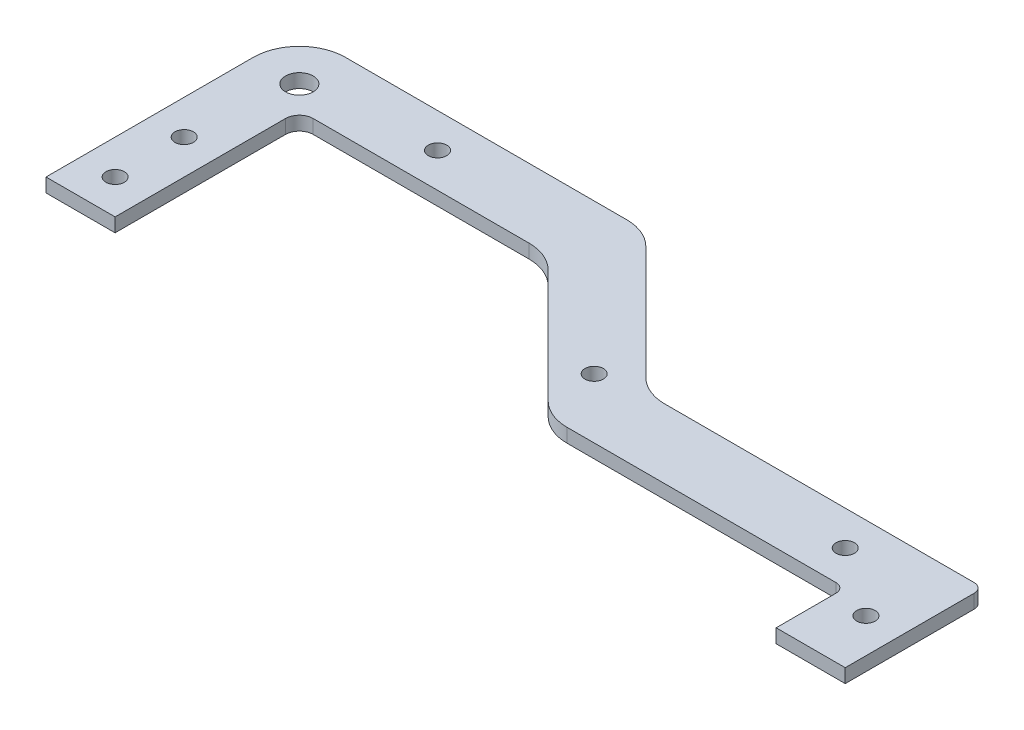
ISO-10303-21;
HEADER;
FILE_DESCRIPTION(('STEP AP214'),'2;1');
FILE_NAME('part.step','',(''),(''),'','','');
FILE_SCHEMA(('AUTOMOTIVE_DESIGN { 1 0 10303 214 1 1 1 1 }'));
ENDSEC;
DATA;
#1=APPLICATION_CONTEXT('core data for automotive mechanical design processes');
#2=APPLICATION_PROTOCOL_DEFINITION('international standard','automotive_design',2000,#1);
#3=PRODUCT_CONTEXT('',#1,'mechanical');
#4=PRODUCT('Part','Part','',(#3));
#5=PRODUCT_RELATED_PRODUCT_CATEGORY('part','',(#4));
#6=PRODUCT_DEFINITION_FORMATION('','',#4);
#7=PRODUCT_DEFINITION_CONTEXT('part definition',#1,'design');
#8=PRODUCT_DEFINITION('design','',#6,#7);
#9=PRODUCT_DEFINITION_SHAPE('','',#8);
#10=(LENGTH_UNIT() NAMED_UNIT(*) SI_UNIT(.MILLI.,.METRE.));
#11=(NAMED_UNIT(*) PLANE_ANGLE_UNIT() SI_UNIT($,.RADIAN.));
#12=(NAMED_UNIT(*) SI_UNIT($,.STERADIAN.) SOLID_ANGLE_UNIT());
#13=UNCERTAINTY_MEASURE_WITH_UNIT(LENGTH_MEASURE(1.E-05),#10,'distance_accuracy_value','');
#14=(GEOMETRIC_REPRESENTATION_CONTEXT(3) GLOBAL_UNCERTAINTY_ASSIGNED_CONTEXT((#13)) GLOBAL_UNIT_ASSIGNED_CONTEXT((#10,
#11,#12)) REPRESENTATION_CONTEXT('',''));
#15=CARTESIAN_POINT('',(0.,0.,0.));
#16=DIRECTION('',(0.,0.,1.));
#17=DIRECTION('',(1.,0.,0.));
#18=AXIS2_PLACEMENT_3D('',#15,#16,#17);
#19=CARTESIAN_POINT('',(-113.286796564404,3.,-30.));
#20=DIRECTION('',(0.,0.,1.));
#21=DIRECTION('',(1.,0.,0.));
#22=AXIS2_PLACEMENT_3D('',#19,#20,#21);
#23=PLANE('',#22);
#24=DIRECTION('',(-1.,0.,0.));
#25=VECTOR('',#24,1.);
#26=CARTESIAN_POINT('',(-113.286796564404,3.,-30.));
#27=LINE('',#26,#25);
#28=CARTESIAN_POINT('',(-42.,3.,-30.));
#29=VERTEX_POINT('',#28);
#30=CARTESIAN_POINT('',(-109.144660940673,3.,-30.));
#31=VERTEX_POINT('',#30);
#32=EDGE_CURVE('E283',#29,#31,#27,.T.);
#33=ORIENTED_EDGE('',*,*,#32,.F.);
#34=DIRECTION('',(0.,-1.,0.));
#35=VECTOR('',#34,1.);
#36=CARTESIAN_POINT('',(-42.,3.,-30.));
#37=LINE('',#36,#35);
#38=CARTESIAN_POINT('',(-42.,0.,-30.));
#39=VERTEX_POINT('',#38);
#40=EDGE_CURVE('E382',#29,#39,#37,.T.);
#41=ORIENTED_EDGE('',*,*,#40,.T.);
#42=DIRECTION('',(-1.,0.,0.));
#43=VECTOR('',#42,1.);
#44=CARTESIAN_POINT('',(-113.286796564404,0.,-30.));
#45=LINE('',#44,#43);
#46=CARTESIAN_POINT('',(-109.144660940673,0.,-30.));
#47=VERTEX_POINT('',#46);
#48=EDGE_CURVE('E240',#39,#47,#45,.T.);
#49=ORIENTED_EDGE('',*,*,#48,.T.);
#50=DIRECTION('',(0.,-1.,0.));
#51=VECTOR('',#50,1.);
#52=CARTESIAN_POINT('',(-109.144660940673,3.,-30.));
#53=LINE('',#52,#51);
#54=EDGE_CURVE('E335',#47,#31,#53,.F.);
#55=ORIENTED_EDGE('',*,*,#54,.T.);
#56=EDGE_LOOP('',(#33,#41,#49,#55));
#57=FACE_BOUND('',#56,.T.);
#58=ADVANCED_FACE('F39',(#57),#23,.F.);
#59=CARTESIAN_POINT('',(-113.286796564404,3.,-30.));
#60=DIRECTION('',(-0.707106781186549,0.,0.707106781186546));
#61=DIRECTION('',(0.707106781186546,0.,0.707106781186549));
#62=AXIS2_PLACEMENT_3D('',#59,#60,#61);
#63=PLANE('',#62);
#64=DIRECTION('',(-0.707106781186546,0.,-0.707106781186549));
#65=VECTOR('',#64,1.);
#66=CARTESIAN_POINT('',(-113.286796564404,3.,-30.));
#67=LINE('',#66,#65);
#68=CARTESIAN_POINT('',(-116.215728752538,3.,-32.9289321881345));
#69=VERTEX_POINT('',#68);
#70=CARTESIAN_POINT('',(-140.857864376269,3.,-57.5710678118655));
#71=VERTEX_POINT('',#70);
#72=EDGE_CURVE('E190',#69,#71,#67,.T.);
#73=ORIENTED_EDGE('',*,*,#72,.F.);
#74=DIRECTION('',(0.,-1.,0.));
#75=VECTOR('',#74,1.);
#76=CARTESIAN_POINT('',(-116.215728752538,0.,-32.9289321881345));
#77=LINE('',#76,#75);
#78=CARTESIAN_POINT('',(-116.215728752538,0.,-32.9289321881345));
#79=VERTEX_POINT('',#78);
#80=EDGE_CURVE('E331',#69,#79,#77,.T.);
#81=ORIENTED_EDGE('',*,*,#80,.T.);
#82=DIRECTION('',(-0.707106781186546,0.,-0.707106781186549));
#83=VECTOR('',#82,1.);
#84=CARTESIAN_POINT('',(-113.286796564404,0.,-30.));
#85=LINE('',#84,#83);
#86=CARTESIAN_POINT('',(-140.857864376269,0.,-57.5710678118655));
#87=VERTEX_POINT('',#86);
#88=EDGE_CURVE('E243',#79,#87,#85,.T.);
#89=ORIENTED_EDGE('',*,*,#88,.T.);
#90=DIRECTION('',(0.,-1.,0.));
#91=VECTOR('',#90,1.);
#92=CARTESIAN_POINT('',(-140.857864376269,3.,-57.5710678118655));
#93=LINE('',#92,#91);
#94=EDGE_CURVE('E200',#87,#71,#93,.F.);
#95=ORIENTED_EDGE('',*,*,#94,.T.);
#96=EDGE_LOOP('',(#73,#81,#89,#95));
#97=FACE_BOUND('',#96,.T.);
#98=ADVANCED_FACE('F473',(#97),#63,.F.);
#99=CARTESIAN_POINT('',(-209.,3.,-60.5));
#100=DIRECTION('',(0.,0.,1.));
#101=DIRECTION('',(1.,0.,0.));
#102=AXIS2_PLACEMENT_3D('',#99,#100,#101);
#103=PLANE('',#102);
#104=DIRECTION('',(-1.,0.,0.));
#105=VECTOR('',#104,1.);
#106=CARTESIAN_POINT('',(-209.,3.,-60.5));
#107=LINE('',#106,#105);
#108=CARTESIAN_POINT('',(-147.928932188135,3.,-60.5));
#109=VERTEX_POINT('',#108);
#110=CARTESIAN_POINT('',(-209.,3.,-60.5));
#111=VERTEX_POINT('',#110);
#112=EDGE_CURVE('E176',#109,#111,#107,.T.);
#113=ORIENTED_EDGE('',*,*,#112,.F.);
#114=DIRECTION('',(0.,-1.,0.));
#115=VECTOR('',#114,1.);
#116=CARTESIAN_POINT('',(-147.928932188135,3.,-60.5));
#117=LINE('',#116,#115);
#118=CARTESIAN_POINT('',(-147.928932188135,0.,-60.5));
#119=VERTEX_POINT('',#118);
#120=EDGE_CURVE('E361',#109,#119,#117,.T.);
#121=ORIENTED_EDGE('',*,*,#120,.T.);
#122=DIRECTION('',(-1.,0.,0.));
#123=VECTOR('',#122,1.);
#124=CARTESIAN_POINT('',(-209.,0.,-60.5));
#125=LINE('',#124,#123);
#126=CARTESIAN_POINT('',(-209.,0.,-60.5));
#127=VERTEX_POINT('',#126);
#128=EDGE_CURVE('E196',#119,#127,#125,.T.);
#129=ORIENTED_EDGE('',*,*,#128,.T.);
#130=DIRECTION('',(0.,-1.,0.));
#131=VECTOR('',#130,1.);
#132=CARTESIAN_POINT('',(-209.,3.,-60.5));
#133=LINE('',#132,#131);
#134=EDGE_CURVE('E193',#111,#127,#133,.T.);
#135=ORIENTED_EDGE('',*,*,#134,.F.);
#136=EDGE_LOOP('',(#113,#121,#129,#135));
#137=FACE_BOUND('',#136,.T.);
#138=ADVANCED_FACE('F194',(#137),#103,.F.);
#139=CARTESIAN_POINT('',(-209.,3.,-50.5));
#140=DIRECTION('',(0.,-1.,0.));
#141=DIRECTION('',(0.,0.,-1.));
#142=AXIS2_PLACEMENT_3D('',#139,#140,#141);
#143=CYLINDRICAL_SURFACE('',#142,10.);
#144=CARTESIAN_POINT('',(-209.,0.,-50.5));
#145=DIRECTION('',(0.,1.,0.));
#146=DIRECTION('',(0.,0.,1.));
#147=AXIS2_PLACEMENT_3D('',#144,#145,#146);
#148=CIRCLE('',#147,10.);
#149=CARTESIAN_POINT('',(-219.,0.,-50.4999999999999));
#150=VERTEX_POINT('',#149);
#151=EDGE_CURVE('E250',#127,#150,#148,.T.);
#152=ORIENTED_EDGE('',*,*,#151,.T.);
#153=DIRECTION('',(0.,-1.,0.));
#154=VECTOR('',#153,1.);
#155=CARTESIAN_POINT('',(-219.,3.,-50.4999999999999));
#156=LINE('',#155,#154);
#157=CARTESIAN_POINT('',(-219.,3.,-50.4999999999999));
#158=VERTEX_POINT('',#157);
#159=EDGE_CURVE('E201',#158,#150,#156,.T.);
#160=ORIENTED_EDGE('',*,*,#159,.F.);
#161=CARTESIAN_POINT('',(-209.,3.,-50.5));
#162=DIRECTION('',(0.,1.,0.));
#163=DIRECTION('',(0.,0.,1.));
#164=AXIS2_PLACEMENT_3D('',#161,#162,#163);
#165=CIRCLE('',#164,10.);
#166=EDGE_CURVE('E181',#111,#158,#165,.T.);
#167=ORIENTED_EDGE('',*,*,#166,.F.);
#168=ORIENTED_EDGE('',*,*,#134,.T.);
#169=EDGE_LOOP('',(#152,#160,#167,#168));
#170=FACE_BOUND('',#169,.T.);
#171=ADVANCED_FACE('F203',(#170),#143,.T.);
#172=CARTESIAN_POINT('',(-219.,3.,-50.4999999999999));
#173=DIRECTION('',(1.,0.,0.));
#174=DIRECTION('',(0.,0.,-1.));
#175=AXIS2_PLACEMENT_3D('',#172,#173,#174);
#176=PLANE('',#175);
#177=DIRECTION('',(0.,0.,1.));
#178=VECTOR('',#177,1.);
#179=CARTESIAN_POINT('',(-219.,0.,-50.4999999999999));
#180=LINE('',#179,#178);
#181=CARTESIAN_POINT('',(-219.,0.,-5.5));
#182=VERTEX_POINT('',#181);
#183=EDGE_CURVE('E253',#150,#182,#180,.T.);
#184=ORIENTED_EDGE('',*,*,#183,.T.);
#185=DIRECTION('',(0.,-1.,0.));
#186=VECTOR('',#185,1.);
#187=CARTESIAN_POINT('',(-219.,3.,-5.5));
#188=LINE('',#187,#186);
#189=CARTESIAN_POINT('',(-219.,3.,-5.5));
#190=VERTEX_POINT('',#189);
#191=EDGE_CURVE('E295',#190,#182,#188,.T.);
#192=ORIENTED_EDGE('',*,*,#191,.F.);
#193=DIRECTION('',(0.,0.,1.));
#194=VECTOR('',#193,1.);
#195=CARTESIAN_POINT('',(-219.,3.,-50.4999999999999));
#196=LINE('',#195,#194);
#197=EDGE_CURVE('E207',#158,#190,#196,.T.);
#198=ORIENTED_EDGE('',*,*,#197,.F.);
#199=ORIENTED_EDGE('',*,*,#159,.T.);
#200=EDGE_LOOP('',(#184,#192,#198,#199));
#201=FACE_BOUND('',#200,.T.);
#202=ADVANCED_FACE('F574',(#201),#176,.F.);
#203=CARTESIAN_POINT('',(-219.,3.,-5.5));
#204=DIRECTION('',(0.,0.,-1.));
#205=DIRECTION('',(-1.,0.,0.));
#206=AXIS2_PLACEMENT_3D('',#203,#204,#205);
#207=PLANE('',#206);
#208=DIRECTION('',(1.,0.,0.));
#209=VECTOR('',#208,1.);
#210=CARTESIAN_POINT('',(-219.,0.,-5.5));
#211=LINE('',#210,#209);
#212=CARTESIAN_POINT('',(-204.,0.,-5.5));
#213=VERTEX_POINT('',#212);
#214=EDGE_CURVE('E256',#182,#213,#211,.T.);
#215=ORIENTED_EDGE('',*,*,#214,.T.);
#216=DIRECTION('',(0.,-1.,0.));
#217=VECTOR('',#216,1.);
#218=CARTESIAN_POINT('',(-204.,3.,-5.5));
#219=LINE('',#218,#217);
#220=CARTESIAN_POINT('',(-204.,3.,-5.5));
#221=VERTEX_POINT('',#220);
#222=EDGE_CURVE('E291',#221,#213,#219,.T.);
#223=ORIENTED_EDGE('',*,*,#222,.F.);
#224=DIRECTION('',(1.,0.,0.));
#225=VECTOR('',#224,1.);
#226=CARTESIAN_POINT('',(-219.,3.,-5.5));
#227=LINE('',#226,#225);
#228=EDGE_CURVE('E210',#190,#221,#227,.T.);
#229=ORIENTED_EDGE('',*,*,#228,.F.);
#230=ORIENTED_EDGE('',*,*,#191,.T.);
#231=EDGE_LOOP('',(#215,#223,#229,#230));
#232=FACE_BOUND('',#231,.T.);
#233=ADVANCED_FACE('F571',(#232),#207,.F.);
#234=CARTESIAN_POINT('',(-204.,3.,-5.5));
#235=DIRECTION('',(-1.,0.,0.));
#236=DIRECTION('',(0.,0.,1.));
#237=AXIS2_PLACEMENT_3D('',#234,#235,#236);
#238=PLANE('',#237);
#239=DIRECTION('',(0.,0.,-1.));
#240=VECTOR('',#239,1.);
#241=CARTESIAN_POINT('',(-204.,0.,-5.5));
#242=LINE('',#241,#240);
#243=CARTESIAN_POINT('',(-204.,0.,-42.5));
#244=VERTEX_POINT('',#243);
#245=EDGE_CURVE('E259',#213,#244,#242,.T.);
#246=ORIENTED_EDGE('',*,*,#245,.T.);
#247=DIRECTION('',(0.,-1.,0.));
#248=VECTOR('',#247,1.);
#249=CARTESIAN_POINT('',(-204.,3.,-42.5));
#250=LINE('',#249,#248);
#251=CARTESIAN_POINT('',(-204.,3.,-42.5));
#252=VERTEX_POINT('',#251);
#253=EDGE_CURVE('E55',#244,#252,#250,.F.);
#254=ORIENTED_EDGE('',*,*,#253,.T.);
#255=DIRECTION('',(0.,0.,-1.));
#256=VECTOR('',#255,1.);
#257=CARTESIAN_POINT('',(-204.,3.,-5.5));
#258=LINE('',#257,#256);
#259=EDGE_CURVE('E216',#221,#252,#258,.T.);
#260=ORIENTED_EDGE('',*,*,#259,.F.);
#261=ORIENTED_EDGE('',*,*,#222,.T.);
#262=EDGE_LOOP('',(#246,#254,#260,#261));
#263=FACE_BOUND('',#262,.T.);
#264=ADVANCED_FACE('F567',(#263),#238,.F.);
#265=CARTESIAN_POINT('',(-204.,3.,-45.5));
#266=DIRECTION('',(0.,0.,-1.));
#267=DIRECTION('',(-1.,0.,0.));
#268=AXIS2_PLACEMENT_3D('',#265,#266,#267);
#269=PLANE('',#268);
#270=DIRECTION('',(1.,0.,0.));
#271=VECTOR('',#270,1.);
#272=CARTESIAN_POINT('',(-204.,3.,-45.5));
#273=LINE('',#272,#271);
#274=CARTESIAN_POINT('',(-201.,3.,-45.5));
#275=VERTEX_POINT('',#274);
#276=CARTESIAN_POINT('',(-154.142135623731,3.,-45.5));
#277=VERTEX_POINT('',#276);
#278=EDGE_CURVE('E219',#275,#277,#273,.T.);
#279=ORIENTED_EDGE('',*,*,#278,.F.);
#280=DIRECTION('',(0.,-1.,0.));
#281=VECTOR('',#280,1.);
#282=CARTESIAN_POINT('',(-201.,0.,-45.5));
#283=LINE('',#282,#281);
#284=CARTESIAN_POINT('',(-201.,0.,-45.5));
#285=VERTEX_POINT('',#284);
#286=EDGE_CURVE('E408',#275,#285,#283,.T.);
#287=ORIENTED_EDGE('',*,*,#286,.T.);
#288=DIRECTION('',(1.,0.,0.));
#289=VECTOR('',#288,1.);
#290=CARTESIAN_POINT('',(-204.,0.,-45.5));
#291=LINE('',#290,#289);
#292=CARTESIAN_POINT('',(-154.142135623731,0.,-45.5));
#293=VERTEX_POINT('',#292);
#294=EDGE_CURVE('E262',#285,#293,#291,.T.);
#295=ORIENTED_EDGE('',*,*,#294,.T.);
#296=DIRECTION('',(0.,-1.,0.));
#297=VECTOR('',#296,1.);
#298=CARTESIAN_POINT('',(-154.142135623731,3.,-45.5));
#299=LINE('',#298,#297);
#300=EDGE_CURVE('E364',#293,#277,#299,.F.);
#301=ORIENTED_EDGE('',*,*,#300,.T.);
#302=EDGE_LOOP('',(#279,#287,#295,#301));
#303=FACE_BOUND('',#302,.T.);
#304=ADVANCED_FACE('F417',(#303),#269,.F.);
#305=CARTESIAN_POINT('',(-150.,3.,-45.5));
#306=DIRECTION('',(0.707106781186549,0.,-0.707106781186546));
#307=DIRECTION('',(-0.707106781186546,0.,-0.707106781186549));
#308=AXIS2_PLACEMENT_3D('',#305,#306,#307);
#309=PLANE('',#308);
#310=DIRECTION('',(0.707106781186546,0.,0.707106781186549));
#311=VECTOR('',#310,1.);
#312=CARTESIAN_POINT('',(-150.,0.,-45.5));
#313=LINE('',#312,#311);
#314=CARTESIAN_POINT('',(-147.071067811866,0.,-42.5710678118655));
#315=VERTEX_POINT('',#314);
#316=CARTESIAN_POINT('',(-122.428932188135,0.,-17.9289321881347));
#317=VERTEX_POINT('',#316);
#318=EDGE_CURVE('E265',#315,#317,#313,.T.);
#319=ORIENTED_EDGE('',*,*,#318,.T.);
#320=DIRECTION('',(0.,-1.,0.));
#321=VECTOR('',#320,1.);
#322=CARTESIAN_POINT('',(-122.428932188135,3.,-17.9289321881347));
#323=LINE('',#322,#321);
#324=CARTESIAN_POINT('',(-122.428932188135,3.,-17.9289321881347));
#325=VERTEX_POINT('',#324);
#326=EDGE_CURVE('E353',#317,#325,#323,.F.);
#327=ORIENTED_EDGE('',*,*,#326,.T.);
#328=DIRECTION('',(0.707106781186546,0.,0.707106781186549));
#329=VECTOR('',#328,1.);
#330=CARTESIAN_POINT('',(-150.,3.,-45.5));
#331=LINE('',#330,#329);
#332=CARTESIAN_POINT('',(-147.071067811866,3.,-42.5710678118655));
#333=VERTEX_POINT('',#332);
#334=EDGE_CURVE('E222',#333,#325,#331,.T.);
#335=ORIENTED_EDGE('',*,*,#334,.F.);
#336=DIRECTION('',(0.,-1.,0.));
#337=VECTOR('',#336,1.);
#338=CARTESIAN_POINT('',(-147.071067811866,0.,-42.5710678118655));
#339=LINE('',#338,#337);
#340=EDGE_CURVE('E349',#333,#315,#339,.T.);
#341=ORIENTED_EDGE('',*,*,#340,.T.);
#342=EDGE_LOOP('',(#319,#327,#335,#341));
#343=FACE_BOUND('',#342,.T.);
#344=ADVANCED_FACE('F431',(#343),#309,.F.);
#345=CARTESIAN_POINT('',(-119.5,3.,-15.0000000000002));
#346=DIRECTION('',(0.,0.,-1.));
#347=DIRECTION('',(-1.,0.,0.));
#348=AXIS2_PLACEMENT_3D('',#345,#346,#347);
#349=PLANE('',#348);
#350=DIRECTION('',(1.,0.,0.));
#351=VECTOR('',#350,1.);
#352=CARTESIAN_POINT('',(-119.5,0.,-15.0000000000002));
#353=LINE('',#352,#351);
#354=CARTESIAN_POINT('',(-115.357864376269,0.,-15.0000000000002));
#355=VERTEX_POINT('',#354);
#356=CARTESIAN_POINT('',(-57.,0.,-15.0000000000002));
#357=VERTEX_POINT('',#356);
#358=EDGE_CURVE('E269',#355,#357,#353,.T.);
#359=ORIENTED_EDGE('',*,*,#358,.T.);
#360=DIRECTION('',(0.,-1.,0.));
#361=VECTOR('',#360,1.);
#362=CARTESIAN_POINT('',(-57.,3.,-15.0000000000002));
#363=LINE('',#362,#361);
#364=CARTESIAN_POINT('',(-57.,3.,-15.0000000000002));
#365=VERTEX_POINT('',#364);
#366=EDGE_CURVE('E399',#357,#365,#363,.F.);
#367=ORIENTED_EDGE('',*,*,#366,.T.);
#368=DIRECTION('',(1.,0.,0.));
#369=VECTOR('',#368,1.);
#370=CARTESIAN_POINT('',(-119.5,3.,-15.0000000000002));
#371=LINE('',#370,#369);
#372=CARTESIAN_POINT('',(-115.357864376269,3.,-15.0000000000002));
#373=VERTEX_POINT('',#372);
#374=EDGE_CURVE('E226',#373,#365,#371,.T.);
#375=ORIENTED_EDGE('',*,*,#374,.F.);
#376=DIRECTION('',(0.,-1.,0.));
#377=VECTOR('',#376,1.);
#378=CARTESIAN_POINT('',(-115.357864376269,3.,-15.0000000000002));
#379=LINE('',#378,#377);
#380=EDGE_CURVE('E339',#373,#355,#379,.T.);
#381=ORIENTED_EDGE('',*,*,#380,.T.);
#382=EDGE_LOOP('',(#359,#367,#375,#381));
#383=FACE_BOUND('',#382,.T.);
#384=ADVANCED_FACE('F439',(#383),#349,.F.);
#385=CARTESIAN_POINT('',(-55.,3.,0.));
#386=DIRECTION('',(1.,0.,0.));
#387=DIRECTION('',(0.,0.,-1.));
#388=AXIS2_PLACEMENT_3D('',#385,#386,#387);
#389=PLANE('',#388);
#390=DIRECTION('',(0.,0.,1.));
#391=VECTOR('',#390,1.);
#392=CARTESIAN_POINT('',(-55.,3.,0.));
#393=LINE('',#392,#391);
#394=CARTESIAN_POINT('',(-55.,3.,-13.0000000000002));
#395=VERTEX_POINT('',#394);
#396=CARTESIAN_POINT('',(-55.,3.,0.));
#397=VERTEX_POINT('',#396);
#398=EDGE_CURVE('E230',#395,#397,#393,.T.);
#399=ORIENTED_EDGE('',*,*,#398,.F.);
#400=DIRECTION('',(0.,-1.,0.));
#401=VECTOR('',#400,1.);
#402=CARTESIAN_POINT('',(-55.,0.,-13.0000000000002));
#403=LINE('',#402,#401);
#404=CARTESIAN_POINT('',(-55.,0.,-13.0000000000002));
#405=VERTEX_POINT('',#404);
#406=EDGE_CURVE('E395',#395,#405,#403,.T.);
#407=ORIENTED_EDGE('',*,*,#406,.T.);
#408=DIRECTION('',(0.,0.,1.));
#409=VECTOR('',#408,1.);
#410=CARTESIAN_POINT('',(-55.,0.,0.));
#411=LINE('',#410,#409);
#412=CARTESIAN_POINT('',(-55.,0.,0.));
#413=VERTEX_POINT('',#412);
#414=EDGE_CURVE('E273',#405,#413,#411,.T.);
#415=ORIENTED_EDGE('',*,*,#414,.T.);
#416=DIRECTION('',(0.,-1.,0.));
#417=VECTOR('',#416,1.);
#418=CARTESIAN_POINT('',(-55.,3.,0.));
#419=LINE('',#418,#417);
#420=EDGE_CURVE('E287',#397,#413,#419,.T.);
#421=ORIENTED_EDGE('',*,*,#420,.F.);
#422=EDGE_LOOP('',(#399,#407,#415,#421));
#423=FACE_BOUND('',#422,.T.);
#424=ADVANCED_FACE('F448',(#423),#389,.F.);
#425=CARTESIAN_POINT('',(-55.,3.,0.));
#426=DIRECTION('',(0.,0.,-1.));
#427=DIRECTION('',(-1.,0.,0.));
#428=AXIS2_PLACEMENT_3D('',#425,#426,#427);
#429=PLANE('',#428);
#430=DIRECTION('',(1.,0.,0.));
#431=VECTOR('',#430,1.);
#432=CARTESIAN_POINT('',(-55.,0.,0.));
#433=LINE('',#432,#431);
#434=CARTESIAN_POINT('',(-40.,0.,0.));
#435=VERTEX_POINT('',#434);
#436=EDGE_CURVE('E276',#413,#435,#433,.T.);
#437=ORIENTED_EDGE('',*,*,#436,.T.);
#438=DIRECTION('',(0.,-1.,0.));
#439=VECTOR('',#438,1.);
#440=CARTESIAN_POINT('',(-40.,3.,0.));
#441=LINE('',#440,#439);
#442=CARTESIAN_POINT('',(-40.,3.,0.));
#443=VERTEX_POINT('',#442);
#444=EDGE_CURVE('E239',#443,#435,#441,.T.);
#445=ORIENTED_EDGE('',*,*,#444,.F.);
#446=DIRECTION('',(1.,0.,0.));
#447=VECTOR('',#446,1.);
#448=CARTESIAN_POINT('',(-55.,3.,0.));
#449=LINE('',#448,#447);
#450=EDGE_CURVE('E233',#397,#443,#449,.T.);
#451=ORIENTED_EDGE('',*,*,#450,.F.);
#452=ORIENTED_EDGE('',*,*,#420,.T.);
#453=EDGE_LOOP('',(#437,#445,#451,#452));
#454=FACE_BOUND('',#453,.T.);
#455=ADVANCED_FACE('F454',(#454),#429,.F.);
#456=CARTESIAN_POINT('',(-40.,3.,0.));
#457=DIRECTION('',(-1.,0.,0.));
#458=DIRECTION('',(0.,0.,1.));
#459=AXIS2_PLACEMENT_3D('',#456,#457,#458);
#460=PLANE('',#459);
#461=DIRECTION('',(0.,0.,-1.));
#462=VECTOR('',#461,1.);
#463=CARTESIAN_POINT('',(-40.,0.,0.));
#464=LINE('',#463,#462);
#465=CARTESIAN_POINT('',(-40.,0.,-28.));
#466=VERTEX_POINT('',#465);
#467=EDGE_CURVE('E279',#435,#466,#464,.T.);
#468=ORIENTED_EDGE('',*,*,#467,.T.);
#469=DIRECTION('',(0.,-1.,0.));
#470=VECTOR('',#469,1.);
#471=CARTESIAN_POINT('',(-40.,3.,-28.));
#472=LINE('',#471,#470);
#473=CARTESIAN_POINT('',(-40.,3.,-28.));
#474=VERTEX_POINT('',#473);
#475=EDGE_CURVE('E389',#466,#474,#472,.F.);
#476=ORIENTED_EDGE('',*,*,#475,.T.);
#477=DIRECTION('',(0.,0.,-1.));
#478=VECTOR('',#477,1.);
#479=CARTESIAN_POINT('',(-40.,3.,0.));
#480=LINE('',#479,#478);
#481=EDGE_CURVE('E236',#443,#474,#480,.T.);
#482=ORIENTED_EDGE('',*,*,#481,.F.);
#483=ORIENTED_EDGE('',*,*,#444,.T.);
#484=EDGE_LOOP('',(#468,#476,#482,#483));
#485=FACE_BOUND('',#484,.T.);
#486=ADVANCED_FACE('F512',(#485),#460,.F.);
#487=CARTESIAN_POINT('',(-209.,3.,-50.5));
#488=DIRECTION('',(0.,1.,0.));
#489=DIRECTION('',(0.,0.,1.));
#490=AXIS2_PLACEMENT_3D('',#487,#488,#489);
#491=PLANE('',#490);
#492=CARTESIAN_POINT('',(-47.5,3.,-12.0000000000002));
#493=DIRECTION('',(0.,1.,0.));
#494=DIRECTION('',(0.,0.,1.));
#495=AXIS2_PLACEMENT_3D('',#492,#493,#494);
#496=CIRCLE('',#495,2.);
#497=CARTESIAN_POINT('',(-47.5,3.,-10.0000000000002));
#498=VERTEX_POINT('',#497);
#499=EDGE_CURVE('E306',#498,#498,#496,.T.);
#500=ORIENTED_EDGE('',*,*,#499,.F.);
#501=EDGE_LOOP('',(#500));
#502=FACE_BOUND('',#501,.T.);
#503=CARTESIAN_POINT('',(-211.5,3.,-13.));
#504=DIRECTION('',(0.,1.,0.));
#505=DIRECTION('',(0.,0.,1.));
#506=AXIS2_PLACEMENT_3D('',#503,#504,#505);
#507=CIRCLE('',#506,2.);
#508=CARTESIAN_POINT('',(-211.5,3.,-11.));
#509=VERTEX_POINT('',#508);
#510=EDGE_CURVE('E499',#509,#509,#507,.T.);
#511=ORIENTED_EDGE('',*,*,#510,.F.);
#512=EDGE_LOOP('',(#511));
#513=FACE_BOUND('',#512,.T.);
#514=CARTESIAN_POINT('',(-211.5,3.,-28.));
#515=DIRECTION('',(0.,1.,0.));
#516=DIRECTION('',(0.,0.,1.));
#517=AXIS2_PLACEMENT_3D('',#514,#515,#516);
#518=CIRCLE('',#517,2.);
#519=CARTESIAN_POINT('',(-211.5,3.,-26.));
#520=VERTEX_POINT('',#519);
#521=EDGE_CURVE('E495',#520,#520,#518,.T.);
#522=ORIENTED_EDGE('',*,*,#521,.F.);
#523=EDGE_LOOP('',(#522));
#524=FACE_BOUND('',#523,.T.);
#525=CARTESIAN_POINT('',(-209.,3.,-50.5));
#526=DIRECTION('',(0.,1.,0.));
#527=DIRECTION('',(0.,0.,1.));
#528=AXIS2_PLACEMENT_3D('',#525,#526,#527);
#529=CIRCLE('',#528,2.99999999999999);
#530=CARTESIAN_POINT('',(-209.,3.,-47.5));
#531=VERTEX_POINT('',#530);
#532=EDGE_CURVE('E491',#531,#531,#529,.T.);
#533=ORIENTED_EDGE('',*,*,#532,.F.);
#534=EDGE_LOOP('',(#533));
#535=FACE_BOUND('',#534,.T.);
#536=CARTESIAN_POINT('',(-181.5,3.,-53.));
#537=DIRECTION('',(0.,1.,0.));
#538=DIRECTION('',(0.,0.,1.));
#539=AXIS2_PLACEMENT_3D('',#536,#537,#538);
#540=CIRCLE('',#539,2.);
#541=CARTESIAN_POINT('',(-181.5,3.,-51.));
#542=VERTEX_POINT('',#541);
#543=EDGE_CURVE('E487',#542,#542,#540,.T.);
#544=ORIENTED_EDGE('',*,*,#543,.F.);
#545=EDGE_LOOP('',(#544));
#546=FACE_BOUND('',#545,.T.);
#547=CARTESIAN_POINT('',(-122.5,3.,-28.));
#548=DIRECTION('',(0.,1.,0.));
#549=DIRECTION('',(0.,0.,1.));
#550=AXIS2_PLACEMENT_3D('',#547,#548,#549);
#551=CIRCLE('',#550,2.);
#552=CARTESIAN_POINT('',(-122.5,3.,-26.));
#553=VERTEX_POINT('',#552);
#554=EDGE_CURVE('E483',#553,#553,#551,.T.);
#555=ORIENTED_EDGE('',*,*,#554,.F.);
#556=EDGE_LOOP('',(#555));
#557=FACE_BOUND('',#556,.T.);
#558=CARTESIAN_POINT('',(-62.5,3.,-22.5));
#559=DIRECTION('',(0.,1.,0.));
#560=DIRECTION('',(0.,0.,1.));
#561=AXIS2_PLACEMENT_3D('',#558,#559,#560);
#562=CIRCLE('',#561,2.);
#563=CARTESIAN_POINT('',(-62.5,3.,-20.5));
#564=VERTEX_POINT('',#563);
#565=EDGE_CURVE('E479',#564,#564,#562,.T.);
#566=ORIENTED_EDGE('',*,*,#565,.F.);
#567=EDGE_LOOP('',(#566));
#568=FACE_BOUND('',#567,.T.);
#569=ORIENTED_EDGE('',*,*,#481,.T.);
#570=CARTESIAN_POINT('',(-42.,3.,-28.));
#571=DIRECTION('',(0.,1.,0.));
#572=DIRECTION('',(0.,0.,1.));
#573=AXIS2_PLACEMENT_3D('',#570,#571,#572);
#574=CIRCLE('',#573,2.);
#575=EDGE_CURVE('E392',#474,#29,#574,.T.);
#576=ORIENTED_EDGE('',*,*,#575,.T.);
#577=ORIENTED_EDGE('',*,*,#32,.T.);
#578=CARTESIAN_POINT('',(-109.144660940673,3.,-40.));
#579=DIRECTION('',(0.,1.,0.));
#580=DIRECTION('',(0.,0.,1.));
#581=AXIS2_PLACEMENT_3D('',#578,#579,#580);
#582=CIRCLE('',#581,10.);
#583=EDGE_CURVE('E372',#31,#69,#582,.F.);
#584=ORIENTED_EDGE('',*,*,#583,.T.);
#585=ORIENTED_EDGE('',*,*,#72,.T.);
#586=CARTESIAN_POINT('',(-147.928932188135,3.,-50.5));
#587=DIRECTION('',(0.,1.,0.));
#588=DIRECTION('',(0.,0.,1.));
#589=AXIS2_PLACEMENT_3D('',#586,#587,#588);
#590=CIRCLE('',#589,10.);
#591=EDGE_CURVE('E185',#71,#109,#590,.T.);
#592=ORIENTED_EDGE('',*,*,#591,.T.);
#593=ORIENTED_EDGE('',*,*,#112,.T.);
#594=ORIENTED_EDGE('',*,*,#166,.T.);
#595=ORIENTED_EDGE('',*,*,#197,.T.);
#596=ORIENTED_EDGE('',*,*,#228,.T.);
#597=ORIENTED_EDGE('',*,*,#259,.T.);
#598=CARTESIAN_POINT('',(-201.,3.,-42.5));
#599=DIRECTION('',(0.,1.,0.));
#600=DIRECTION('',(0.,0.,1.));
#601=AXIS2_PLACEMENT_3D('',#598,#599,#600);
#602=CIRCLE('',#601,3.);
#603=EDGE_CURVE('E11',#252,#275,#602,.F.);
#604=ORIENTED_EDGE('',*,*,#603,.T.);
#605=ORIENTED_EDGE('',*,*,#278,.T.);
#606=CARTESIAN_POINT('',(-154.142135623731,3.,-35.5));
#607=DIRECTION('',(0.,1.,0.));
#608=DIRECTION('',(0.,0.,1.));
#609=AXIS2_PLACEMENT_3D('',#606,#607,#608);
#610=CIRCLE('',#609,10.);
#611=EDGE_CURVE('E379',#277,#333,#610,.F.);
#612=ORIENTED_EDGE('',*,*,#611,.T.);
#613=ORIENTED_EDGE('',*,*,#334,.T.);
#614=CARTESIAN_POINT('',(-115.357864376269,3.,-25.0000000000002));
#615=DIRECTION('',(0.,1.,0.));
#616=DIRECTION('',(0.,0.,1.));
#617=AXIS2_PLACEMENT_3D('',#614,#615,#616);
#618=CIRCLE('',#617,10.);
#619=EDGE_CURVE('E358',#325,#373,#618,.T.);
#620=ORIENTED_EDGE('',*,*,#619,.T.);
#621=ORIENTED_EDGE('',*,*,#374,.T.);
#622=CARTESIAN_POINT('',(-57.,3.,-13.0000000000002));
#623=DIRECTION('',(0.,1.,0.));
#624=DIRECTION('',(0.,0.,1.));
#625=AXIS2_PLACEMENT_3D('',#622,#623,#624);
#626=CIRCLE('',#625,2.);
#627=EDGE_CURVE('E405',#365,#395,#626,.F.);
#628=ORIENTED_EDGE('',*,*,#627,.T.);
#629=ORIENTED_EDGE('',*,*,#398,.T.);
#630=ORIENTED_EDGE('',*,*,#450,.T.);
#631=EDGE_LOOP('',(#569,#576,#577,#584,#585,#592,#593,#594,#595,#596,#597,#604,#605,#612,#613,
#620,#621,#628,#629,#630));
#632=FACE_BOUND('',#631,.T.);
#633=ADVANCED_FACE('F179',(#502,#513,#524,#535,#546,#557,#568,#632),#491,.T.);
#634=CARTESIAN_POINT('',(-209.,0.,-50.5));
#635=DIRECTION('',(0.,1.,0.));
#636=DIRECTION('',(0.,0.,1.));
#637=AXIS2_PLACEMENT_3D('',#634,#635,#636);
#638=PLANE('',#637);
#639=CARTESIAN_POINT('',(-47.5,0.,-12.0000000000002));
#640=DIRECTION('',(0.,1.,0.));
#641=DIRECTION('',(0.,0.,1.));
#642=AXIS2_PLACEMENT_3D('',#639,#640,#641);
#643=CIRCLE('',#642,2.);
#644=CARTESIAN_POINT('',(-47.5,0.,-10.0000000000002));
#645=VERTEX_POINT('',#644);
#646=EDGE_CURVE('E244',#645,#645,#643,.T.);
#647=ORIENTED_EDGE('',*,*,#646,.T.);
#648=EDGE_LOOP('',(#647));
#649=FACE_BOUND('',#648,.T.);
#650=CARTESIAN_POINT('',(-211.5,0.,-13.));
#651=DIRECTION('',(0.,1.,0.));
#652=DIRECTION('',(0.,0.,1.));
#653=AXIS2_PLACEMENT_3D('',#650,#651,#652);
#654=CIRCLE('',#653,2.);
#655=CARTESIAN_POINT('',(-211.5,0.,-11.));
#656=VERTEX_POINT('',#655);
#657=EDGE_CURVE('E322',#656,#656,#654,.T.);
#658=ORIENTED_EDGE('',*,*,#657,.T.);
#659=EDGE_LOOP('',(#658));
#660=FACE_BOUND('',#659,.T.);
#661=CARTESIAN_POINT('',(-211.5,0.,-28.));
#662=DIRECTION('',(0.,1.,0.));
#663=DIRECTION('',(0.,0.,1.));
#664=AXIS2_PLACEMENT_3D('',#661,#662,#663);
#665=CIRCLE('',#664,2.);
#666=CARTESIAN_POINT('',(-211.5,0.,-26.));
#667=VERTEX_POINT('',#666);
#668=EDGE_CURVE('E318',#667,#667,#665,.T.);
#669=ORIENTED_EDGE('',*,*,#668,.T.);
#670=EDGE_LOOP('',(#669));
#671=FACE_BOUND('',#670,.T.);
#672=CARTESIAN_POINT('',(-209.,0.,-50.5));
#673=DIRECTION('',(0.,1.,0.));
#674=DIRECTION('',(0.,0.,1.));
#675=AXIS2_PLACEMENT_3D('',#672,#673,#674);
#676=CIRCLE('',#675,2.99999999999999);
#677=CARTESIAN_POINT('',(-209.,0.,-47.5));
#678=VERTEX_POINT('',#677);
#679=EDGE_CURVE('E314',#678,#678,#676,.T.);
#680=ORIENTED_EDGE('',*,*,#679,.T.);
#681=EDGE_LOOP('',(#680));
#682=FACE_BOUND('',#681,.T.);
#683=CARTESIAN_POINT('',(-181.5,0.,-53.));
#684=DIRECTION('',(0.,1.,0.));
#685=DIRECTION('',(0.,0.,1.));
#686=AXIS2_PLACEMENT_3D('',#683,#684,#685);
#687=CIRCLE('',#686,2.);
#688=CARTESIAN_POINT('',(-181.5,0.,-51.));
#689=VERTEX_POINT('',#688);
#690=EDGE_CURVE('E310',#689,#689,#687,.T.);
#691=ORIENTED_EDGE('',*,*,#690,.T.);
#692=EDGE_LOOP('',(#691));
#693=FACE_BOUND('',#692,.T.);
#694=CARTESIAN_POINT('',(-122.5,0.,-28.));
#695=DIRECTION('',(0.,1.,0.));
#696=DIRECTION('',(0.,0.,1.));
#697=AXIS2_PLACEMENT_3D('',#694,#695,#696);
#698=CIRCLE('',#697,2.);
#699=CARTESIAN_POINT('',(-122.5,0.,-26.));
#700=VERTEX_POINT('',#699);
#701=EDGE_CURVE('E305',#700,#700,#698,.T.);
#702=ORIENTED_EDGE('',*,*,#701,.T.);
#703=EDGE_LOOP('',(#702));
#704=FACE_BOUND('',#703,.T.);
#705=CARTESIAN_POINT('',(-62.5,0.,-22.5));
#706=DIRECTION('',(0.,1.,0.));
#707=DIRECTION('',(0.,0.,1.));
#708=AXIS2_PLACEMENT_3D('',#705,#706,#707);
#709=CIRCLE('',#708,2.);
#710=CARTESIAN_POINT('',(-62.5,0.,-20.5));
#711=VERTEX_POINT('',#710);
#712=EDGE_CURVE('E301',#711,#711,#709,.T.);
#713=ORIENTED_EDGE('',*,*,#712,.T.);
#714=EDGE_LOOP('',(#713));
#715=FACE_BOUND('',#714,.T.);
#716=ORIENTED_EDGE('',*,*,#48,.F.);
#717=CARTESIAN_POINT('',(-42.,0.,-28.));
#718=DIRECTION('',(0.,1.,0.));
#719=DIRECTION('',(0.,0.,1.));
#720=AXIS2_PLACEMENT_3D('',#717,#718,#719);
#721=CIRCLE('',#720,2.);
#722=EDGE_CURVE('E386',#39,#466,#721,.F.);
#723=ORIENTED_EDGE('',*,*,#722,.T.);
#724=ORIENTED_EDGE('',*,*,#467,.F.);
#725=ORIENTED_EDGE('',*,*,#436,.F.);
#726=ORIENTED_EDGE('',*,*,#414,.F.);
#727=CARTESIAN_POINT('',(-57.,0.,-13.0000000000002));
#728=DIRECTION('',(0.,1.,0.));
#729=DIRECTION('',(0.,0.,1.));
#730=AXIS2_PLACEMENT_3D('',#727,#728,#729);
#731=CIRCLE('',#730,2.);
#732=EDGE_CURVE('E402',#405,#357,#731,.T.);
#733=ORIENTED_EDGE('',*,*,#732,.T.);
#734=ORIENTED_EDGE('',*,*,#358,.F.);
#735=CARTESIAN_POINT('',(-115.357864376269,0.,-25.0000000000002));
#736=DIRECTION('',(0.,1.,0.));
#737=DIRECTION('',(0.,0.,1.));
#738=AXIS2_PLACEMENT_3D('',#735,#736,#737);
#739=CIRCLE('',#738,10.);
#740=EDGE_CURVE('E346',#355,#317,#739,.F.);
#741=ORIENTED_EDGE('',*,*,#740,.T.);
#742=ORIENTED_EDGE('',*,*,#318,.F.);
#743=CARTESIAN_POINT('',(-154.142135623731,0.,-35.5));
#744=DIRECTION('',(0.,1.,0.));
#745=DIRECTION('',(0.,0.,1.));
#746=AXIS2_PLACEMENT_3D('',#743,#744,#745);
#747=CIRCLE('',#746,10.);
#748=EDGE_CURVE('E375',#315,#293,#747,.T.);
#749=ORIENTED_EDGE('',*,*,#748,.T.);
#750=ORIENTED_EDGE('',*,*,#294,.F.);
#751=CARTESIAN_POINT('',(-201.,0.,-42.5));
#752=DIRECTION('',(0.,1.,0.));
#753=DIRECTION('',(0.,0.,1.));
#754=AXIS2_PLACEMENT_3D('',#751,#752,#753);
#755=CIRCLE('',#754,3.);
#756=EDGE_CURVE('E48',#285,#244,#755,.T.);
#757=ORIENTED_EDGE('',*,*,#756,.T.);
#758=ORIENTED_EDGE('',*,*,#245,.F.);
#759=ORIENTED_EDGE('',*,*,#214,.F.);
#760=ORIENTED_EDGE('',*,*,#183,.F.);
#761=ORIENTED_EDGE('',*,*,#151,.F.);
#762=ORIENTED_EDGE('',*,*,#128,.F.);
#763=CARTESIAN_POINT('',(-147.928932188135,0.,-50.5));
#764=DIRECTION('',(0.,1.,0.));
#765=DIRECTION('',(0.,0.,1.));
#766=AXIS2_PLACEMENT_3D('',#763,#764,#765);
#767=CIRCLE('',#766,10.);
#768=EDGE_CURVE('E343',#119,#87,#767,.F.);
#769=ORIENTED_EDGE('',*,*,#768,.T.);
#770=ORIENTED_EDGE('',*,*,#88,.F.);
#771=CARTESIAN_POINT('',(-109.144660940673,0.,-40.));
#772=DIRECTION('',(0.,1.,0.));
#773=DIRECTION('',(0.,0.,1.));
#774=AXIS2_PLACEMENT_3D('',#771,#772,#773);
#775=CIRCLE('',#774,10.);
#776=EDGE_CURVE('E368',#79,#47,#775,.T.);
#777=ORIENTED_EDGE('',*,*,#776,.T.);
#778=EDGE_LOOP('',(#716,#723,#724,#725,#726,#733,#734,#741,#742,#749,#750,#757,#758,#759,#760,
#761,#762,#769,#770,#777));
#779=FACE_BOUND('',#778,.T.);
#780=ADVANCED_FACE('F421',(#649,#660,#671,#682,#693,#704,#715,#779),#638,.F.);
#781=CARTESIAN_POINT('',(-62.5,-7.,-22.5));
#782=DIRECTION('',(0.,1.,0.));
#783=DIRECTION('',(0.,0.,1.));
#784=AXIS2_PLACEMENT_3D('',#781,#782,#783);
#785=CYLINDRICAL_SURFACE('',#784,2.);
#786=ORIENTED_EDGE('',*,*,#565,.T.);
#787=EDGE_LOOP('',(#786));
#788=FACE_BOUND('',#787,.T.);
#789=ORIENTED_EDGE('',*,*,#712,.F.);
#790=EDGE_LOOP('',(#789));
#791=FACE_BOUND('',#790,.T.);
#792=ADVANCED_FACE('F526',(#788,#791),#785,.F.);
#793=CARTESIAN_POINT('',(-122.5,-7.,-28.));
#794=DIRECTION('',(0.,1.,0.));
#795=DIRECTION('',(0.,0.,1.));
#796=AXIS2_PLACEMENT_3D('',#793,#794,#795);
#797=CYLINDRICAL_SURFACE('',#796,2.);
#798=ORIENTED_EDGE('',*,*,#554,.T.);
#799=EDGE_LOOP('',(#798));
#800=FACE_BOUND('',#799,.T.);
#801=ORIENTED_EDGE('',*,*,#701,.F.);
#802=EDGE_LOOP('',(#801));
#803=FACE_BOUND('',#802,.T.);
#804=ADVANCED_FACE('F529',(#800,#803),#797,.F.);
#805=CARTESIAN_POINT('',(-181.5,-7.,-53.));
#806=DIRECTION('',(0.,1.,0.));
#807=DIRECTION('',(0.,0.,1.));
#808=AXIS2_PLACEMENT_3D('',#805,#806,#807);
#809=CYLINDRICAL_SURFACE('',#808,2.);
#810=ORIENTED_EDGE('',*,*,#543,.T.);
#811=EDGE_LOOP('',(#810));
#812=FACE_BOUND('',#811,.T.);
#813=ORIENTED_EDGE('',*,*,#690,.F.);
#814=EDGE_LOOP('',(#813));
#815=FACE_BOUND('',#814,.T.);
#816=ADVANCED_FACE('F634',(#812,#815),#809,.F.);
#817=CARTESIAN_POINT('',(-209.,-7.,-50.5));
#818=DIRECTION('',(0.,1.,0.));
#819=DIRECTION('',(0.,0.,1.));
#820=AXIS2_PLACEMENT_3D('',#817,#818,#819);
#821=CYLINDRICAL_SURFACE('',#820,2.99999999999999);
#822=ORIENTED_EDGE('',*,*,#532,.T.);
#823=EDGE_LOOP('',(#822));
#824=FACE_BOUND('',#823,.T.);
#825=ORIENTED_EDGE('',*,*,#679,.F.);
#826=EDGE_LOOP('',(#825));
#827=FACE_BOUND('',#826,.T.);
#828=ADVANCED_FACE('F644',(#824,#827),#821,.F.);
#829=CARTESIAN_POINT('',(-211.5,-7.,-28.));
#830=DIRECTION('',(0.,1.,0.));
#831=DIRECTION('',(0.,0.,1.));
#832=AXIS2_PLACEMENT_3D('',#829,#830,#831);
#833=CYLINDRICAL_SURFACE('',#832,2.);
#834=ORIENTED_EDGE('',*,*,#521,.T.);
#835=EDGE_LOOP('',(#834));
#836=FACE_BOUND('',#835,.T.);
#837=ORIENTED_EDGE('',*,*,#668,.F.);
#838=EDGE_LOOP('',(#837));
#839=FACE_BOUND('',#838,.T.);
#840=ADVANCED_FACE('F654',(#836,#839),#833,.F.);
#841=CARTESIAN_POINT('',(-211.5,-7.,-13.));
#842=DIRECTION('',(0.,1.,0.));
#843=DIRECTION('',(0.,0.,1.));
#844=AXIS2_PLACEMENT_3D('',#841,#842,#843);
#845=CYLINDRICAL_SURFACE('',#844,2.);
#846=ORIENTED_EDGE('',*,*,#510,.T.);
#847=EDGE_LOOP('',(#846));
#848=FACE_BOUND('',#847,.T.);
#849=ORIENTED_EDGE('',*,*,#657,.F.);
#850=EDGE_LOOP('',(#849));
#851=FACE_BOUND('',#850,.T.);
#852=ADVANCED_FACE('F664',(#848,#851),#845,.F.);
#853=CARTESIAN_POINT('',(-47.5,-7.,-12.0000000000002));
#854=DIRECTION('',(0.,1.,0.));
#855=DIRECTION('',(0.,0.,1.));
#856=AXIS2_PLACEMENT_3D('',#853,#854,#855);
#857=CYLINDRICAL_SURFACE('',#856,2.);
#858=ORIENTED_EDGE('',*,*,#499,.T.);
#859=EDGE_LOOP('',(#858));
#860=FACE_BOUND('',#859,.T.);
#861=ORIENTED_EDGE('',*,*,#646,.F.);
#862=EDGE_LOOP('',(#861));
#863=FACE_BOUND('',#862,.T.);
#864=ADVANCED_FACE('F507',(#860,#863),#857,.F.);
#865=CARTESIAN_POINT('',(-109.144660940673,3.,-40.));
#866=DIRECTION('',(0.,1.,0.));
#867=DIRECTION('',(0.,0.,1.));
#868=AXIS2_PLACEMENT_3D('',#865,#866,#867);
#869=CYLINDRICAL_SURFACE('',#868,10.);
#870=ORIENTED_EDGE('',*,*,#583,.F.);
#871=ORIENTED_EDGE('',*,*,#54,.F.);
#872=ORIENTED_EDGE('',*,*,#776,.F.);
#873=ORIENTED_EDGE('',*,*,#80,.F.);
#874=EDGE_LOOP('',(#870,#871,#872,#873));
#875=FACE_BOUND('',#874,.T.);
#876=ADVANCED_FACE('F470',(#875),#869,.F.);
#877=CARTESIAN_POINT('',(-115.357864376269,3.,-25.0000000000002));
#878=DIRECTION('',(0.,-1.,0.));
#879=DIRECTION('',(0.,0.,-1.));
#880=AXIS2_PLACEMENT_3D('',#877,#878,#879);
#881=CYLINDRICAL_SURFACE('',#880,10.);
#882=ORIENTED_EDGE('',*,*,#619,.F.);
#883=ORIENTED_EDGE('',*,*,#326,.F.);
#884=ORIENTED_EDGE('',*,*,#740,.F.);
#885=ORIENTED_EDGE('',*,*,#380,.F.);
#886=EDGE_LOOP('',(#882,#883,#884,#885));
#887=FACE_BOUND('',#886,.T.);
#888=ADVANCED_FACE('F434',(#887),#881,.T.);
#889=CARTESIAN_POINT('',(-147.928932188135,3.,-50.5));
#890=DIRECTION('',(0.,-1.,0.));
#891=DIRECTION('',(0.,0.,-1.));
#892=AXIS2_PLACEMENT_3D('',#889,#890,#891);
#893=CYLINDRICAL_SURFACE('',#892,10.);
#894=ORIENTED_EDGE('',*,*,#591,.F.);
#895=ORIENTED_EDGE('',*,*,#94,.F.);
#896=ORIENTED_EDGE('',*,*,#768,.F.);
#897=ORIENTED_EDGE('',*,*,#120,.F.);
#898=EDGE_LOOP('',(#894,#895,#896,#897));
#899=FACE_BOUND('',#898,.T.);
#900=ADVANCED_FACE('F552',(#899),#893,.T.);
#901=CARTESIAN_POINT('',(-154.142135623731,3.,-35.5));
#902=DIRECTION('',(0.,1.,0.));
#903=DIRECTION('',(0.,0.,1.));
#904=AXIS2_PLACEMENT_3D('',#901,#902,#903);
#905=CYLINDRICAL_SURFACE('',#904,10.);
#906=ORIENTED_EDGE('',*,*,#611,.F.);
#907=ORIENTED_EDGE('',*,*,#300,.F.);
#908=ORIENTED_EDGE('',*,*,#748,.F.);
#909=ORIENTED_EDGE('',*,*,#340,.F.);
#910=EDGE_LOOP('',(#906,#907,#908,#909));
#911=FACE_BOUND('',#910,.T.);
#912=ADVANCED_FACE('F427',(#911),#905,.F.);
#913=CARTESIAN_POINT('',(-42.,3.,-28.));
#914=DIRECTION('',(0.,-1.,0.));
#915=DIRECTION('',(0.,0.,-1.));
#916=AXIS2_PLACEMENT_3D('',#913,#914,#915);
#917=CYLINDRICAL_SURFACE('',#916,2.);
#918=ORIENTED_EDGE('',*,*,#575,.F.);
#919=ORIENTED_EDGE('',*,*,#475,.F.);
#920=ORIENTED_EDGE('',*,*,#722,.F.);
#921=ORIENTED_EDGE('',*,*,#40,.F.);
#922=EDGE_LOOP('',(#918,#919,#920,#921));
#923=FACE_BOUND('',#922,.T.);
#924=ADVANCED_FACE('F462',(#923),#917,.T.);
#925=CARTESIAN_POINT('',(-57.,3.,-13.0000000000002));
#926=DIRECTION('',(0.,1.,0.));
#927=DIRECTION('',(0.,0.,1.));
#928=AXIS2_PLACEMENT_3D('',#925,#926,#927);
#929=CYLINDRICAL_SURFACE('',#928,2.);
#930=ORIENTED_EDGE('',*,*,#627,.F.);
#931=ORIENTED_EDGE('',*,*,#366,.F.);
#932=ORIENTED_EDGE('',*,*,#732,.F.);
#933=ORIENTED_EDGE('',*,*,#406,.F.);
#934=EDGE_LOOP('',(#930,#931,#932,#933));
#935=FACE_BOUND('',#934,.T.);
#936=ADVANCED_FACE('F443',(#935),#929,.F.);
#937=CARTESIAN_POINT('',(-201.,3.,-42.5));
#938=DIRECTION('',(0.,1.,0.));
#939=DIRECTION('',(0.,0.,1.));
#940=AXIS2_PLACEMENT_3D('',#937,#938,#939);
#941=CYLINDRICAL_SURFACE('',#940,3.);
#942=ORIENTED_EDGE('',*,*,#603,.F.);
#943=ORIENTED_EDGE('',*,*,#253,.F.);
#944=ORIENTED_EDGE('',*,*,#756,.F.);
#945=ORIENTED_EDGE('',*,*,#286,.F.);
#946=EDGE_LOOP('',(#942,#943,#944,#945));
#947=FACE_BOUND('',#946,.T.);
#948=ADVANCED_FACE('F41',(#947),#941,.F.);
#949=CLOSED_SHELL('',(#58,#98,#138,#171,#202,#233,#264,#304,#344,#384,#424,#455,#486,#633,#780,
#792,#804,#816,#828,#840,#852,#864,#876,#888,#900,#912,#924,#936,#948));
#950=MANIFOLD_SOLID_BREP('B2',#949);
#951=ADVANCED_BREP_SHAPE_REPRESENTATION('',(#18,#950),#14);
#952=SHAPE_DEFINITION_REPRESENTATION(#9,#951);
ENDSEC;
END-ISO-10303-21;
